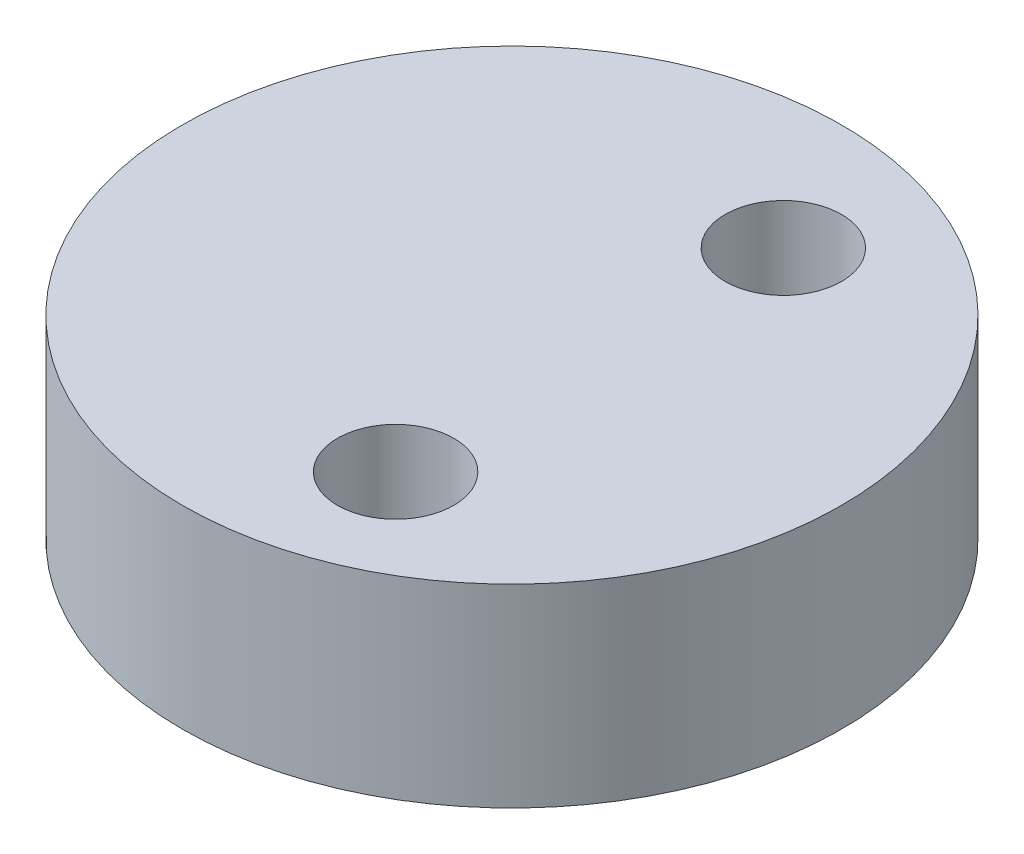
ISO-10303-21;
HEADER;
FILE_DESCRIPTION(('STEP AP214'),'2;1');
FILE_NAME('part.step','',(''),(''),'','','');
FILE_SCHEMA(('AUTOMOTIVE_DESIGN { 1 0 10303 214 1 1 1 1 }'));
ENDSEC;
DATA;
#1=APPLICATION_CONTEXT('core data for automotive mechanical design processes');
#2=APPLICATION_PROTOCOL_DEFINITION('international standard','automotive_design',2000,#1);
#3=PRODUCT_CONTEXT('',#1,'mechanical');
#4=PRODUCT('Part','Part','',(#3));
#5=PRODUCT_RELATED_PRODUCT_CATEGORY('part','',(#4));
#6=PRODUCT_DEFINITION_FORMATION('','',#4);
#7=PRODUCT_DEFINITION_CONTEXT('part definition',#1,'design');
#8=PRODUCT_DEFINITION('design','',#6,#7);
#9=PRODUCT_DEFINITION_SHAPE('','',#8);
#10=(LENGTH_UNIT() NAMED_UNIT(*) SI_UNIT(.MILLI.,.METRE.));
#11=(NAMED_UNIT(*) PLANE_ANGLE_UNIT() SI_UNIT($,.RADIAN.));
#12=(NAMED_UNIT(*) SI_UNIT($,.STERADIAN.) SOLID_ANGLE_UNIT());
#13=UNCERTAINTY_MEASURE_WITH_UNIT(LENGTH_MEASURE(1.E-05),#10,'distance_accuracy_value','');
#14=(GEOMETRIC_REPRESENTATION_CONTEXT(3) GLOBAL_UNCERTAINTY_ASSIGNED_CONTEXT((#13)) GLOBAL_UNIT_ASSIGNED_CONTEXT((#10,
#11,#12)) REPRESENTATION_CONTEXT('',''));
#15=CARTESIAN_POINT('',(0.,0.,0.));
#16=DIRECTION('',(0.,0.,1.));
#17=DIRECTION('',(1.,0.,0.));
#18=AXIS2_PLACEMENT_3D('',#15,#16,#17);
#19=CARTESIAN_POINT('',(-2.,5.,0.));
#20=DIRECTION('',(0.,1.,0.));
#21=DIRECTION('',(0.,0.,1.));
#22=AXIS2_PLACEMENT_3D('',#19,#20,#21);
#23=PLANE('',#22);
#24=CARTESIAN_POINT('',(0.,5.,-5.));
#25=DIRECTION('',(0.,1.,0.));
#26=DIRECTION('',(0.,0.,1.));
#27=AXIS2_PLACEMENT_3D('',#24,#25,#26);
#28=CIRCLE('',#27,1.5);
#29=CARTESIAN_POINT('',(0.,5.,-3.5));
#30=VERTEX_POINT('',#29);
#31=EDGE_CURVE('E42',#30,#30,#28,.T.);
#32=ORIENTED_EDGE('',*,*,#31,.F.);
#33=EDGE_LOOP('',(#32));
#34=FACE_BOUND('',#33,.T.);
#35=CARTESIAN_POINT('',(-2.,5.,0.));
#36=DIRECTION('',(0.,1.,0.));
#37=DIRECTION('',(0.,0.,1.));
#38=AXIS2_PLACEMENT_3D('',#35,#36,#37);
#39=CIRCLE('',#38,8.5);
#40=CARTESIAN_POINT('',(-2.,5.,8.5));
#41=VERTEX_POINT('',#40);
#42=EDGE_CURVE('E10',#41,#41,#39,.T.);
#43=ORIENTED_EDGE('',*,*,#42,.T.);
#44=EDGE_LOOP('',(#43));
#45=FACE_BOUND('',#44,.T.);
#46=CARTESIAN_POINT('',(-1.23364023357426E-13,5.,5.));
#47=DIRECTION('',(0.,1.,0.));
#48=DIRECTION('',(0.,0.,1.));
#49=AXIS2_PLACEMENT_3D('',#46,#47,#48);
#50=CIRCLE('',#49,1.5);
#51=CARTESIAN_POINT('',(-1.23364023357426E-13,5.,6.5));
#52=VERTEX_POINT('',#51);
#53=EDGE_CURVE('E47',#52,#52,#50,.T.);
#54=ORIENTED_EDGE('',*,*,#53,.F.);
#55=EDGE_LOOP('',(#54));
#56=FACE_BOUND('',#55,.T.);
#57=ADVANCED_FACE('F31',(#34,#45,#56),#23,.T.);
#58=CARTESIAN_POINT('',(-2.,0.,0.));
#59=DIRECTION('',(0.,1.,0.));
#60=DIRECTION('',(0.,0.,1.));
#61=AXIS2_PLACEMENT_3D('',#58,#59,#60);
#62=PLANE('',#61);
#63=CARTESIAN_POINT('',(-2.,0.,0.));
#64=DIRECTION('',(0.,1.,0.));
#65=DIRECTION('',(0.,0.,1.));
#66=AXIS2_PLACEMENT_3D('',#63,#64,#65);
#67=CIRCLE('',#66,8.5);
#68=CARTESIAN_POINT('',(-2.,0.,8.5));
#69=VERTEX_POINT('',#68);
#70=EDGE_CURVE('E35',#69,#69,#67,.T.);
#71=ORIENTED_EDGE('',*,*,#70,.F.);
#72=EDGE_LOOP('',(#71));
#73=FACE_BOUND('',#72,.T.);
#74=CARTESIAN_POINT('',(0.,0.,-5.));
#75=DIRECTION('',(0.,1.,0.));
#76=DIRECTION('',(0.,0.,1.));
#77=AXIS2_PLACEMENT_3D('',#74,#75,#76);
#78=CIRCLE('',#77,1.5);
#79=CARTESIAN_POINT('',(0.,0.,-3.5));
#80=VERTEX_POINT('',#79);
#81=EDGE_CURVE('E44',#80,#80,#78,.T.);
#82=ORIENTED_EDGE('',*,*,#81,.T.);
#83=EDGE_LOOP('',(#82));
#84=FACE_BOUND('',#83,.T.);
#85=CARTESIAN_POINT('',(-1.23364023357426E-13,0.,5.));
#86=DIRECTION('',(0.,1.,0.));
#87=DIRECTION('',(0.,0.,1.));
#88=AXIS2_PLACEMENT_3D('',#85,#86,#87);
#89=CIRCLE('',#88,1.5);
#90=CARTESIAN_POINT('',(-1.23364023357426E-13,0.,6.5));
#91=VERTEX_POINT('',#90);
#92=EDGE_CURVE('E50',#91,#91,#89,.T.);
#93=ORIENTED_EDGE('',*,*,#92,.T.);
#94=EDGE_LOOP('',(#93));
#95=FACE_BOUND('',#94,.T.);
#96=ADVANCED_FACE('F60',(#73,#84,#95),#62,.F.);
#97=CARTESIAN_POINT('',(-2.,5.,0.));
#98=DIRECTION('',(0.,-1.,0.));
#99=DIRECTION('',(0.,0.,-1.));
#100=AXIS2_PLACEMENT_3D('',#97,#98,#99);
#101=CYLINDRICAL_SURFACE('',#100,8.5);
#102=ORIENTED_EDGE('',*,*,#42,.F.);
#103=EDGE_LOOP('',(#102));
#104=FACE_BOUND('',#103,.T.);
#105=ORIENTED_EDGE('',*,*,#70,.T.);
#106=EDGE_LOOP('',(#105));
#107=FACE_BOUND('',#106,.T.);
#108=ADVANCED_FACE('F33',(#104,#107),#101,.T.);
#109=CARTESIAN_POINT('',(0.,5.,-5.));
#110=DIRECTION('',(0.,-1.,0.));
#111=DIRECTION('',(0.,0.,-1.));
#112=AXIS2_PLACEMENT_3D('',#109,#110,#111);
#113=CYLINDRICAL_SURFACE('',#112,1.5);
#114=ORIENTED_EDGE('',*,*,#31,.T.);
#115=EDGE_LOOP('',(#114));
#116=FACE_BOUND('',#115,.T.);
#117=ORIENTED_EDGE('',*,*,#81,.F.);
#118=EDGE_LOOP('',(#117));
#119=FACE_BOUND('',#118,.T.);
#120=ADVANCED_FACE('F69',(#116,#119),#113,.F.);
#121=CARTESIAN_POINT('',(-1.23364023357426E-13,5.,5.));
#122=DIRECTION('',(0.,-1.,0.));
#123=DIRECTION('',(0.,0.,-1.));
#124=AXIS2_PLACEMENT_3D('',#121,#122,#123);
#125=CYLINDRICAL_SURFACE('',#124,1.5);
#126=ORIENTED_EDGE('',*,*,#53,.T.);
#127=EDGE_LOOP('',(#126));
#128=FACE_BOUND('',#127,.T.);
#129=ORIENTED_EDGE('',*,*,#92,.F.);
#130=EDGE_LOOP('',(#129));
#131=FACE_BOUND('',#130,.T.);
#132=ADVANCED_FACE('F56',(#128,#131),#125,.F.);
#133=CLOSED_SHELL('',(#57,#96,#108,#120,#132));
#134=MANIFOLD_SOLID_BREP('B2',#133);
#135=ADVANCED_BREP_SHAPE_REPRESENTATION('',(#18,#134),#14);
#136=SHAPE_DEFINITION_REPRESENTATION(#9,#135);
ENDSEC;
END-ISO-10303-21;
